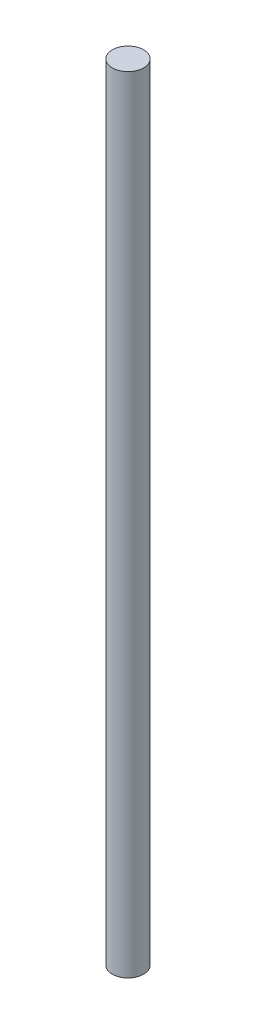
ISO-10303-21;
HEADER;
FILE_DESCRIPTION(('STEP AP214'),'2;1');
FILE_NAME('part.step','',(''),(''),'','','');
FILE_SCHEMA(('AUTOMOTIVE_DESIGN { 1 0 10303 214 1 1 1 1 }'));
ENDSEC;
DATA;
#1=APPLICATION_CONTEXT('core data for automotive mechanical design processes');
#2=APPLICATION_PROTOCOL_DEFINITION('international standard','automotive_design',2000,#1);
#3=PRODUCT_CONTEXT('',#1,'mechanical');
#4=PRODUCT('Part','Part','',(#3));
#5=PRODUCT_RELATED_PRODUCT_CATEGORY('part','',(#4));
#6=PRODUCT_DEFINITION_FORMATION('','',#4);
#7=PRODUCT_DEFINITION_CONTEXT('part definition',#1,'design');
#8=PRODUCT_DEFINITION('design','',#6,#7);
#9=PRODUCT_DEFINITION_SHAPE('','',#8);
#10=(LENGTH_UNIT() NAMED_UNIT(*) SI_UNIT(.MILLI.,.METRE.));
#11=(NAMED_UNIT(*) PLANE_ANGLE_UNIT() SI_UNIT($,.RADIAN.));
#12=(NAMED_UNIT(*) SI_UNIT($,.STERADIAN.) SOLID_ANGLE_UNIT());
#13=UNCERTAINTY_MEASURE_WITH_UNIT(LENGTH_MEASURE(1.E-05),#10,'distance_accuracy_value','');
#14=(GEOMETRIC_REPRESENTATION_CONTEXT(3) GLOBAL_UNCERTAINTY_ASSIGNED_CONTEXT((#13)) GLOBAL_UNIT_ASSIGNED_CONTEXT((#10,
#11,#12)) REPRESENTATION_CONTEXT('',''));
#15=CARTESIAN_POINT('',(0.,0.,0.));
#16=DIRECTION('',(0.,0.,1.));
#17=DIRECTION('',(1.,0.,0.));
#18=AXIS2_PLACEMENT_3D('',#15,#16,#17);
#19=CARTESIAN_POINT('',(0.,500.,0.));
#20=DIRECTION('',(0.,-1.,0.));
#21=DIRECTION('',(0.,0.,-1.));
#22=AXIS2_PLACEMENT_3D('',#19,#20,#21);
#23=CYLINDRICAL_SURFACE('',#22,10.);
#24=CARTESIAN_POINT('',(0.,500.,0.));
#25=DIRECTION('',(0.,1.,0.));
#26=DIRECTION('',(0.,0.,1.));
#27=AXIS2_PLACEMENT_3D('',#24,#25,#26);
#28=CIRCLE('',#27,10.);
#29=CARTESIAN_POINT('',(0.,500.,10.));
#30=VERTEX_POINT('',#29);
#31=EDGE_CURVE('E10',#30,#30,#28,.T.);
#32=ORIENTED_EDGE('',*,*,#31,.F.);
#33=EDGE_LOOP('',(#32));
#34=FACE_BOUND('',#33,.T.);
#35=CARTESIAN_POINT('',(0.,0.,0.));
#36=DIRECTION('',(0.,1.,0.));
#37=DIRECTION('',(0.,0.,1.));
#38=AXIS2_PLACEMENT_3D('',#35,#36,#37);
#39=CIRCLE('',#38,10.);
#40=CARTESIAN_POINT('',(0.,0.,10.));
#41=VERTEX_POINT('',#40);
#42=EDGE_CURVE('E36',#41,#41,#39,.T.);
#43=ORIENTED_EDGE('',*,*,#42,.T.);
#44=EDGE_LOOP('',(#43));
#45=FACE_BOUND('',#44,.T.);
#46=ADVANCED_FACE('F33',(#34,#45),#23,.T.);
#47=CARTESIAN_POINT('',(0.,500.,0.));
#48=DIRECTION('',(0.,1.,0.));
#49=DIRECTION('',(0.,0.,1.));
#50=AXIS2_PLACEMENT_3D('',#47,#48,#49);
#51=PLANE('',#50);
#52=ORIENTED_EDGE('',*,*,#31,.T.);
#53=EDGE_LOOP('',(#52));
#54=FACE_BOUND('',#53,.T.);
#55=ADVANCED_FACE('F48',(#54),#51,.T.);
#56=CARTESIAN_POINT('',(0.,0.,0.));
#57=DIRECTION('',(0.,1.,0.));
#58=DIRECTION('',(0.,0.,1.));
#59=AXIS2_PLACEMENT_3D('',#56,#57,#58);
#60=PLANE('',#59);
#61=ORIENTED_EDGE('',*,*,#42,.F.);
#62=EDGE_LOOP('',(#61));
#63=FACE_BOUND('',#62,.T.);
#64=ADVANCED_FACE('F46',(#63),#60,.F.);
#65=CLOSED_SHELL('',(#46,#55,#64));
#66=MANIFOLD_SOLID_BREP('B2',#65);
#67=ADVANCED_BREP_SHAPE_REPRESENTATION('',(#18,#66),#14);
#68=SHAPE_DEFINITION_REPRESENTATION(#9,#67);
ENDSEC;
END-ISO-10303-21;
